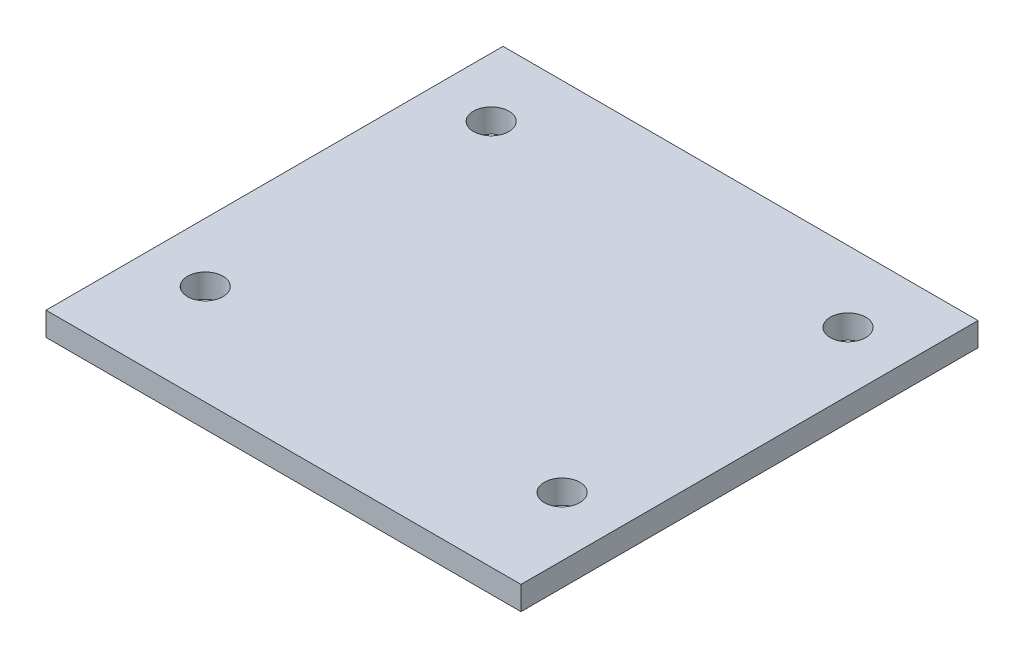
ISO-10303-21;
HEADER;
FILE_DESCRIPTION(('STEP AP214'),'2;1');
FILE_NAME('part.step','',(''),(''),'','','');
FILE_SCHEMA(('AUTOMOTIVE_DESIGN { 1 0 10303 214 1 1 1 1 }'));
ENDSEC;
DATA;
#1=APPLICATION_CONTEXT('core data for automotive mechanical design processes');
#2=APPLICATION_PROTOCOL_DEFINITION('international standard','automotive_design',2000,#1);
#3=PRODUCT_CONTEXT('',#1,'mechanical');
#4=PRODUCT('Part','Part','',(#3));
#5=PRODUCT_RELATED_PRODUCT_CATEGORY('part','',(#4));
#6=PRODUCT_DEFINITION_FORMATION('','',#4);
#7=PRODUCT_DEFINITION_CONTEXT('part definition',#1,'design');
#8=PRODUCT_DEFINITION('design','',#6,#7);
#9=PRODUCT_DEFINITION_SHAPE('','',#8);
#10=(LENGTH_UNIT() NAMED_UNIT(*) SI_UNIT(.MILLI.,.METRE.));
#11=(NAMED_UNIT(*) PLANE_ANGLE_UNIT() SI_UNIT($,.RADIAN.));
#12=(NAMED_UNIT(*) SI_UNIT($,.STERADIAN.) SOLID_ANGLE_UNIT());
#13=UNCERTAINTY_MEASURE_WITH_UNIT(LENGTH_MEASURE(1.E-05),#10,'distance_accuracy_value','');
#14=(GEOMETRIC_REPRESENTATION_CONTEXT(3) GLOBAL_UNCERTAINTY_ASSIGNED_CONTEXT((#13)) GLOBAL_UNIT_ASSIGNED_CONTEXT((#10,
#11,#12)) REPRESENTATION_CONTEXT('',''));
#15=CARTESIAN_POINT('',(0.,0.,0.));
#16=DIRECTION('',(0.,0.,1.));
#17=DIRECTION('',(1.,0.,0.));
#18=AXIS2_PLACEMENT_3D('',#15,#16,#17);
#19=CARTESIAN_POINT('',(0.,2.,0.));
#20=DIRECTION('',(0.,1.,0.));
#21=DIRECTION('',(0.,0.,1.));
#22=AXIS2_PLACEMENT_3D('',#19,#20,#21);
#23=PLANE('',#22);
#24=CARTESIAN_POINT('',(15.1,2.,10.8605720333673));
#25=DIRECTION('',(0.,1.,0.));
#26=DIRECTION('',(0.,0.,1.));
#27=AXIS2_PLACEMENT_3D('',#24,#25,#26);
#28=CIRCLE('',#27,1.49999999999999);
#29=CARTESIAN_POINT('',(15.1,2.,12.3605720333673));
#30=VERTEX_POINT('',#29);
#31=EDGE_CURVE('E125',#30,#30,#28,.T.);
#32=ORIENTED_EDGE('',*,*,#31,.F.);
#33=EDGE_LOOP('',(#32));
#34=FACE_BOUND('',#33,.T.);
#35=CARTESIAN_POINT('',(-15.1,2.,-13.3394279666327));
#36=DIRECTION('',(0.,1.,0.));
#37=DIRECTION('',(0.,0.,1.));
#38=AXIS2_PLACEMENT_3D('',#35,#36,#37);
#39=CIRCLE('',#38,1.5);
#40=CARTESIAN_POINT('',(-15.1,2.,-11.8394279666327));
#41=VERTEX_POINT('',#40);
#42=EDGE_CURVE('E104',#41,#41,#39,.T.);
#43=ORIENTED_EDGE('',*,*,#42,.F.);
#44=EDGE_LOOP('',(#43));
#45=FACE_BOUND('',#44,.T.);
#46=DIRECTION('',(0.,0.,1.));
#47=VECTOR('',#46,1.);
#48=CARTESIAN_POINT('',(-20.1,2.,-19.3394279666327));
#49=LINE('',#48,#47);
#50=CARTESIAN_POINT('',(-20.1,2.,-19.3394279666327));
#51=VERTEX_POINT('',#50);
#52=CARTESIAN_POINT('',(-20.1,2.,19.3394279666327));
#53=VERTEX_POINT('',#52);
#54=EDGE_CURVE('E89',#51,#53,#49,.T.);
#55=ORIENTED_EDGE('',*,*,#54,.T.);
#56=DIRECTION('',(1.,0.,0.));
#57=VECTOR('',#56,1.);
#58=CARTESIAN_POINT('',(-20.1,2.,19.3394279666327));
#59=LINE('',#58,#57);
#60=CARTESIAN_POINT('',(20.1,2.,19.3394279666327));
#61=VERTEX_POINT('',#60);
#62=EDGE_CURVE('E84',#53,#61,#59,.T.);
#63=ORIENTED_EDGE('',*,*,#62,.T.);
#64=DIRECTION('',(0.,0.,-1.));
#65=VECTOR('',#64,1.);
#66=CARTESIAN_POINT('',(20.1,2.,19.3394279666327));
#67=LINE('',#66,#65);
#68=CARTESIAN_POINT('',(20.1,2.,-19.3394279666327));
#69=VERTEX_POINT('',#68);
#70=EDGE_CURVE('E87',#61,#69,#67,.T.);
#71=ORIENTED_EDGE('',*,*,#70,.T.);
#72=DIRECTION('',(-1.,0.,0.));
#73=VECTOR('',#72,1.);
#74=CARTESIAN_POINT('',(20.1,2.,-19.3394279666327));
#75=LINE('',#74,#73);
#76=EDGE_CURVE('E54',#69,#51,#75,.T.);
#77=ORIENTED_EDGE('',*,*,#76,.T.);
#78=EDGE_LOOP('',(#55,#63,#71,#77));
#79=FACE_BOUND('',#78,.T.);
#80=CARTESIAN_POINT('',(15.1,2.,-13.3394279666327));
#81=DIRECTION('',(0.,1.,0.));
#82=DIRECTION('',(0.,0.,1.));
#83=AXIS2_PLACEMENT_3D('',#80,#81,#82);
#84=CIRCLE('',#83,1.5);
#85=CARTESIAN_POINT('',(15.1,2.,-11.8394279666327));
#86=VERTEX_POINT('',#85);
#87=EDGE_CURVE('E119',#86,#86,#84,.T.);
#88=ORIENTED_EDGE('',*,*,#87,.F.);
#89=EDGE_LOOP('',(#88));
#90=FACE_BOUND('',#89,.T.);
#91=CARTESIAN_POINT('',(-15.1,2.,10.8605720333673));
#92=DIRECTION('',(0.,1.,0.));
#93=DIRECTION('',(0.,0.,1.));
#94=AXIS2_PLACEMENT_3D('',#91,#92,#93);
#95=CIRCLE('',#94,1.5);
#96=CARTESIAN_POINT('',(-15.1,2.,12.3605720333673));
#97=VERTEX_POINT('',#96);
#98=EDGE_CURVE('E131',#97,#97,#95,.T.);
#99=ORIENTED_EDGE('',*,*,#98,.F.);
#100=EDGE_LOOP('',(#99));
#101=FACE_BOUND('',#100,.T.);
#102=ADVANCED_FACE('F37',(#34,#45,#79,#90,#101),#23,.T.);
#103=CARTESIAN_POINT('',(0.,0.,0.));
#104=DIRECTION('',(0.,1.,0.));
#105=DIRECTION('',(0.,0.,1.));
#106=AXIS2_PLACEMENT_3D('',#103,#104,#105);
#107=PLANE('',#106);
#108=DIRECTION('',(0.,0.,1.));
#109=VECTOR('',#108,1.);
#110=CARTESIAN_POINT('',(-20.1,0.,-19.3394279666327));
#111=LINE('',#110,#109);
#112=CARTESIAN_POINT('',(-20.1,0.,-19.3394279666327));
#113=VERTEX_POINT('',#112);
#114=CARTESIAN_POINT('',(-20.1,0.,19.3394279666327));
#115=VERTEX_POINT('',#114);
#116=EDGE_CURVE('E101',#113,#115,#111,.T.);
#117=ORIENTED_EDGE('',*,*,#116,.F.);
#118=DIRECTION('',(-1.,0.,0.));
#119=VECTOR('',#118,1.);
#120=CARTESIAN_POINT('',(20.1,0.,-19.3394279666327));
#121=LINE('',#120,#119);
#122=CARTESIAN_POINT('',(20.1,0.,-19.3394279666327));
#123=VERTEX_POINT('',#122);
#124=EDGE_CURVE('E77',#123,#113,#121,.T.);
#125=ORIENTED_EDGE('',*,*,#124,.F.);
#126=DIRECTION('',(0.,0.,-1.));
#127=VECTOR('',#126,1.);
#128=CARTESIAN_POINT('',(20.1,0.,19.3394279666327));
#129=LINE('',#128,#127);
#130=CARTESIAN_POINT('',(20.1,0.,19.3394279666327));
#131=VERTEX_POINT('',#130);
#132=EDGE_CURVE('E71',#131,#123,#129,.T.);
#133=ORIENTED_EDGE('',*,*,#132,.F.);
#134=DIRECTION('',(1.,0.,0.));
#135=VECTOR('',#134,1.);
#136=CARTESIAN_POINT('',(-20.1,0.,19.3394279666327));
#137=LINE('',#136,#135);
#138=EDGE_CURVE('E93',#115,#131,#137,.T.);
#139=ORIENTED_EDGE('',*,*,#138,.F.);
#140=EDGE_LOOP('',(#117,#125,#133,#139));
#141=FACE_BOUND('',#140,.T.);
#142=CARTESIAN_POINT('',(-15.1,0.,-13.3394279666327));
#143=DIRECTION('',(0.,1.,0.));
#144=DIRECTION('',(0.,0.,1.));
#145=AXIS2_PLACEMENT_3D('',#142,#143,#144);
#146=CIRCLE('',#145,1.5);
#147=CARTESIAN_POINT('',(-15.1,0.,-11.8394279666327));
#148=VERTEX_POINT('',#147);
#149=EDGE_CURVE('E116',#148,#148,#146,.T.);
#150=ORIENTED_EDGE('',*,*,#149,.T.);
#151=EDGE_LOOP('',(#150));
#152=FACE_BOUND('',#151,.T.);
#153=CARTESIAN_POINT('',(15.1,0.,-13.3394279666327));
#154=DIRECTION('',(0.,1.,0.));
#155=DIRECTION('',(0.,0.,1.));
#156=AXIS2_PLACEMENT_3D('',#153,#154,#155);
#157=CIRCLE('',#156,1.5);
#158=CARTESIAN_POINT('',(15.1,0.,-11.8394279666327));
#159=VERTEX_POINT('',#158);
#160=EDGE_CURVE('E122',#159,#159,#157,.T.);
#161=ORIENTED_EDGE('',*,*,#160,.T.);
#162=EDGE_LOOP('',(#161));
#163=FACE_BOUND('',#162,.T.);
#164=CARTESIAN_POINT('',(15.1,0.,10.8605720333673));
#165=DIRECTION('',(0.,1.,0.));
#166=DIRECTION('',(0.,0.,1.));
#167=AXIS2_PLACEMENT_3D('',#164,#165,#166);
#168=CIRCLE('',#167,1.49999999999999);
#169=CARTESIAN_POINT('',(15.1,0.,12.3605720333673));
#170=VERTEX_POINT('',#169);
#171=EDGE_CURVE('E128',#170,#170,#168,.T.);
#172=ORIENTED_EDGE('',*,*,#171,.T.);
#173=EDGE_LOOP('',(#172));
#174=FACE_BOUND('',#173,.T.);
#175=CARTESIAN_POINT('',(-15.1,0.,10.8605720333673));
#176=DIRECTION('',(0.,1.,0.));
#177=DIRECTION('',(0.,0.,1.));
#178=AXIS2_PLACEMENT_3D('',#175,#176,#177);
#179=CIRCLE('',#178,1.5);
#180=CARTESIAN_POINT('',(-15.1,0.,12.3605720333673));
#181=VERTEX_POINT('',#180);
#182=EDGE_CURVE('E134',#181,#181,#179,.T.);
#183=ORIENTED_EDGE('',*,*,#182,.T.);
#184=EDGE_LOOP('',(#183));
#185=FACE_BOUND('',#184,.T.);
#186=ADVANCED_FACE('F112',(#141,#152,#163,#174,#185),#107,.F.);
#187=CARTESIAN_POINT('',(-20.1,2.,-19.3394279666327));
#188=DIRECTION('',(1.,0.,0.));
#189=DIRECTION('',(0.,0.,-1.));
#190=AXIS2_PLACEMENT_3D('',#187,#188,#189);
#191=PLANE('',#190);
#192=ORIENTED_EDGE('',*,*,#116,.T.);
#193=DIRECTION('',(0.,-1.,0.));
#194=VECTOR('',#193,1.);
#195=CARTESIAN_POINT('',(-20.1,2.,19.3394279666327));
#196=LINE('',#195,#194);
#197=EDGE_CURVE('E11',#53,#115,#196,.T.);
#198=ORIENTED_EDGE('',*,*,#197,.F.);
#199=ORIENTED_EDGE('',*,*,#54,.F.);
#200=DIRECTION('',(0.,-1.,0.));
#201=VECTOR('',#200,1.);
#202=CARTESIAN_POINT('',(-20.1,2.,-19.3394279666327));
#203=LINE('',#202,#201);
#204=EDGE_CURVE('E97',#51,#113,#203,.T.);
#205=ORIENTED_EDGE('',*,*,#204,.T.);
#206=EDGE_LOOP('',(#192,#198,#199,#205));
#207=FACE_BOUND('',#206,.T.);
#208=ADVANCED_FACE('F39',(#207),#191,.F.);
#209=CARTESIAN_POINT('',(-20.1,2.,19.3394279666327));
#210=DIRECTION('',(0.,0.,-1.));
#211=DIRECTION('',(-1.,0.,0.));
#212=AXIS2_PLACEMENT_3D('',#209,#210,#211);
#213=PLANE('',#212);
#214=ORIENTED_EDGE('',*,*,#138,.T.);
#215=DIRECTION('',(0.,-1.,0.));
#216=VECTOR('',#215,1.);
#217=CARTESIAN_POINT('',(20.1,2.,19.3394279666327));
#218=LINE('',#217,#216);
#219=EDGE_CURVE('E46',#61,#131,#218,.T.);
#220=ORIENTED_EDGE('',*,*,#219,.F.);
#221=ORIENTED_EDGE('',*,*,#62,.F.);
#222=ORIENTED_EDGE('',*,*,#197,.T.);
#223=EDGE_LOOP('',(#214,#220,#221,#222));
#224=FACE_BOUND('',#223,.T.);
#225=ADVANCED_FACE('F92',(#224),#213,.F.);
#226=CARTESIAN_POINT('',(20.1,2.,19.3394279666327));
#227=DIRECTION('',(-1.,0.,0.));
#228=DIRECTION('',(0.,0.,1.));
#229=AXIS2_PLACEMENT_3D('',#226,#227,#228);
#230=PLANE('',#229);
#231=ORIENTED_EDGE('',*,*,#132,.T.);
#232=DIRECTION('',(0.,-1.,0.));
#233=VECTOR('',#232,1.);
#234=CARTESIAN_POINT('',(20.1,2.,-19.3394279666327));
#235=LINE('',#234,#233);
#236=EDGE_CURVE('E94',#69,#123,#235,.T.);
#237=ORIENTED_EDGE('',*,*,#236,.F.);
#238=ORIENTED_EDGE('',*,*,#70,.F.);
#239=ORIENTED_EDGE('',*,*,#219,.T.);
#240=EDGE_LOOP('',(#231,#237,#238,#239));
#241=FACE_BOUND('',#240,.T.);
#242=ADVANCED_FACE('F95',(#241),#230,.F.);
#243=CARTESIAN_POINT('',(20.1,2.,-19.3394279666327));
#244=DIRECTION('',(0.,0.,1.));
#245=DIRECTION('',(1.,0.,0.));
#246=AXIS2_PLACEMENT_3D('',#243,#244,#245);
#247=PLANE('',#246);
#248=ORIENTED_EDGE('',*,*,#124,.T.);
#249=ORIENTED_EDGE('',*,*,#204,.F.);
#250=ORIENTED_EDGE('',*,*,#76,.F.);
#251=ORIENTED_EDGE('',*,*,#236,.T.);
#252=EDGE_LOOP('',(#248,#249,#250,#251));
#253=FACE_BOUND('',#252,.T.);
#254=ADVANCED_FACE('F109',(#253),#247,.F.);
#255=CARTESIAN_POINT('',(-15.1,2.,-13.3394279666327));
#256=DIRECTION('',(0.,-1.,0.));
#257=DIRECTION('',(0.,0.,-1.));
#258=AXIS2_PLACEMENT_3D('',#255,#256,#257);
#259=CYLINDRICAL_SURFACE('',#258,1.5);
#260=ORIENTED_EDGE('',*,*,#42,.T.);
#261=EDGE_LOOP('',(#260));
#262=FACE_BOUND('',#261,.T.);
#263=ORIENTED_EDGE('',*,*,#149,.F.);
#264=EDGE_LOOP('',(#263));
#265=FACE_BOUND('',#264,.T.);
#266=ADVANCED_FACE('F153',(#262,#265),#259,.F.);
#267=CARTESIAN_POINT('',(15.1,2.,-13.3394279666327));
#268=DIRECTION('',(0.,-1.,0.));
#269=DIRECTION('',(0.,0.,-1.));
#270=AXIS2_PLACEMENT_3D('',#267,#268,#269);
#271=CYLINDRICAL_SURFACE('',#270,1.5);
#272=ORIENTED_EDGE('',*,*,#87,.T.);
#273=EDGE_LOOP('',(#272));
#274=FACE_BOUND('',#273,.T.);
#275=ORIENTED_EDGE('',*,*,#160,.F.);
#276=EDGE_LOOP('',(#275));
#277=FACE_BOUND('',#276,.T.);
#278=ADVANCED_FACE('F207',(#274,#277),#271,.F.);
#279=CARTESIAN_POINT('',(15.1,2.,10.8605720333673));
#280=DIRECTION('',(0.,-1.,0.));
#281=DIRECTION('',(0.,0.,-1.));
#282=AXIS2_PLACEMENT_3D('',#279,#280,#281);
#283=CYLINDRICAL_SURFACE('',#282,1.49999999999999);
#284=ORIENTED_EDGE('',*,*,#31,.T.);
#285=EDGE_LOOP('',(#284));
#286=FACE_BOUND('',#285,.T.);
#287=ORIENTED_EDGE('',*,*,#171,.F.);
#288=EDGE_LOOP('',(#287));
#289=FACE_BOUND('',#288,.T.);
#290=ADVANCED_FACE('F216',(#286,#289),#283,.F.);
#291=CARTESIAN_POINT('',(-15.1,2.,10.8605720333673));
#292=DIRECTION('',(0.,-1.,0.));
#293=DIRECTION('',(0.,0.,-1.));
#294=AXIS2_PLACEMENT_3D('',#291,#292,#293);
#295=CYLINDRICAL_SURFACE('',#294,1.5);
#296=ORIENTED_EDGE('',*,*,#98,.T.);
#297=EDGE_LOOP('',(#296));
#298=FACE_BOUND('',#297,.T.);
#299=ORIENTED_EDGE('',*,*,#182,.F.);
#300=EDGE_LOOP('',(#299));
#301=FACE_BOUND('',#300,.T.);
#302=ADVANCED_FACE('F140',(#298,#301),#295,.F.);
#303=CLOSED_SHELL('',(#102,#186,#208,#225,#242,#254,#266,#278,#290,#302));
#304=MANIFOLD_SOLID_BREP('B2',#303);
#305=ADVANCED_BREP_SHAPE_REPRESENTATION('',(#18,#304),#14);
#306=SHAPE_DEFINITION_REPRESENTATION(#9,#305);
ENDSEC;
END-ISO-10303-21;
